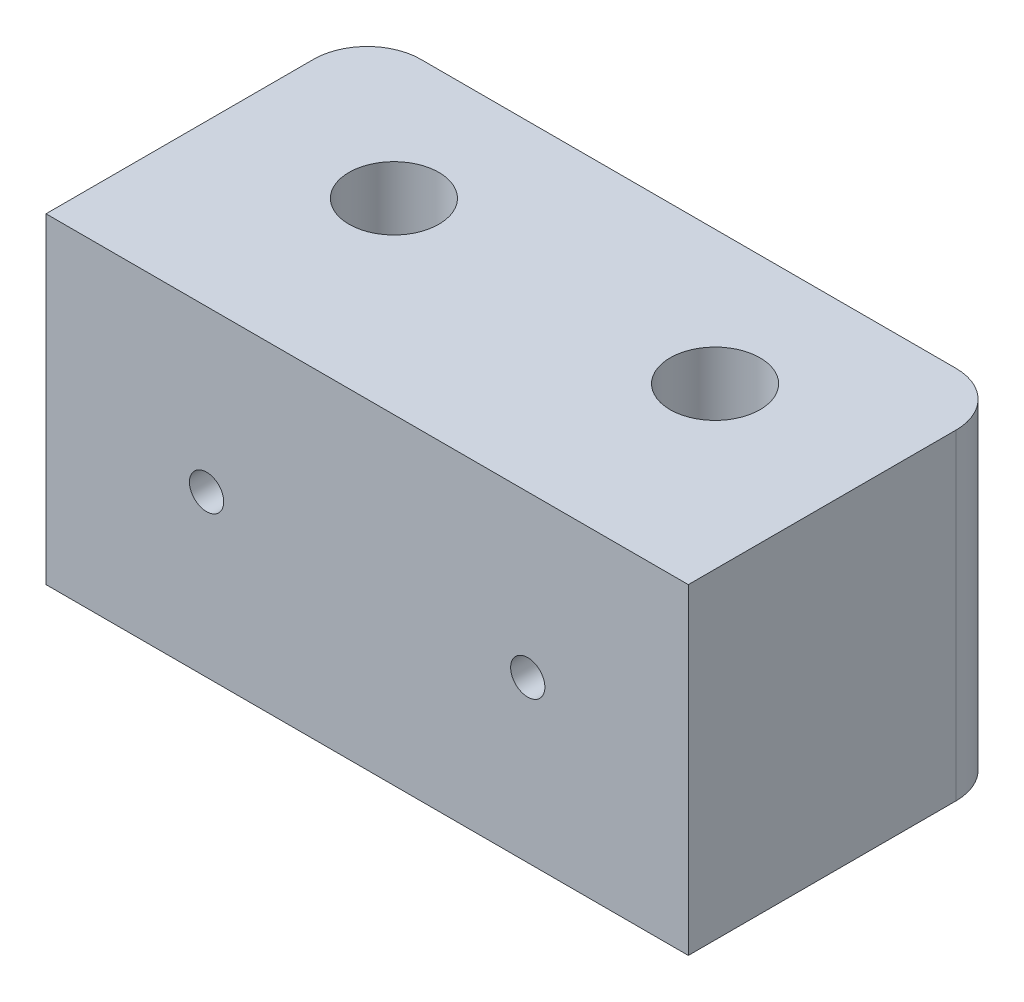
ISO-10303-21;
HEADER;
FILE_DESCRIPTION(('STEP AP214'),'2;1');
FILE_NAME('part.step','',(''),(''),'','','');
FILE_SCHEMA(('AUTOMOTIVE_DESIGN { 1 0 10303 214 1 1 1 1 }'));
ENDSEC;
DATA;
#1=APPLICATION_CONTEXT('core data for automotive mechanical design processes');
#2=APPLICATION_PROTOCOL_DEFINITION('international standard','automotive_design',2000,#1);
#3=PRODUCT_CONTEXT('',#1,'mechanical');
#4=PRODUCT('Part','Part','',(#3));
#5=PRODUCT_RELATED_PRODUCT_CATEGORY('part','',(#4));
#6=PRODUCT_DEFINITION_FORMATION('','',#4);
#7=PRODUCT_DEFINITION_CONTEXT('part definition',#1,'design');
#8=PRODUCT_DEFINITION('design','',#6,#7);
#9=PRODUCT_DEFINITION_SHAPE('','',#8);
#10=(LENGTH_UNIT() NAMED_UNIT(*) SI_UNIT(.MILLI.,.METRE.));
#11=(NAMED_UNIT(*) PLANE_ANGLE_UNIT() SI_UNIT($,.RADIAN.));
#12=(NAMED_UNIT(*) SI_UNIT($,.STERADIAN.) SOLID_ANGLE_UNIT());
#13=UNCERTAINTY_MEASURE_WITH_UNIT(LENGTH_MEASURE(1.E-05),#10,'distance_accuracy_value','');
#14=(GEOMETRIC_REPRESENTATION_CONTEXT(3) GLOBAL_UNCERTAINTY_ASSIGNED_CONTEXT((#13)) GLOBAL_UNIT_ASSIGNED_CONTEXT((#10,
#11,#12)) REPRESENTATION_CONTEXT('',''));
#15=CARTESIAN_POINT('',(0.,0.,0.));
#16=DIRECTION('',(0.,0.,1.));
#17=DIRECTION('',(1.,0.,0.));
#18=AXIS2_PLACEMENT_3D('',#15,#16,#17);
#19=CARTESIAN_POINT('',(-15.,15.,-7.5));
#20=DIRECTION('',(1.,0.,0.));
#21=DIRECTION('',(0.,0.,-1.));
#22=AXIS2_PLACEMENT_3D('',#19,#20,#21);
#23=PLANE('',#22);
#24=DIRECTION('',(0.,0.,1.));
#25=VECTOR('',#24,1.);
#26=CARTESIAN_POINT('',(-15.,15.,-7.5));
#27=LINE('',#26,#25);
#28=CARTESIAN_POINT('',(-15.,15.,-5.));
#29=VERTEX_POINT('',#28);
#30=CARTESIAN_POINT('',(-15.,15.,7.5));
#31=VERTEX_POINT('',#30);
#32=EDGE_CURVE('E140',#29,#31,#27,.T.);
#33=ORIENTED_EDGE('',*,*,#32,.F.);
#34=DIRECTION('',(0.,-1.,0.));
#35=VECTOR('',#34,1.);
#36=CARTESIAN_POINT('',(-15.,15.,-5.));
#37=LINE('',#36,#35);
#38=CARTESIAN_POINT('',(-15.,0.,-5.));
#39=VERTEX_POINT('',#38);
#40=EDGE_CURVE('E161',#29,#39,#37,.T.);
#41=ORIENTED_EDGE('',*,*,#40,.T.);
#42=DIRECTION('',(0.,0.,1.));
#43=VECTOR('',#42,1.);
#44=CARTESIAN_POINT('',(-15.,0.,-7.5));
#45=LINE('',#44,#43);
#46=CARTESIAN_POINT('',(-15.,0.,7.5));
#47=VERTEX_POINT('',#46);
#48=EDGE_CURVE('E139',#39,#47,#45,.T.);
#49=ORIENTED_EDGE('',*,*,#48,.T.);
#50=DIRECTION('',(0.,-1.,0.));
#51=VECTOR('',#50,1.);
#52=CARTESIAN_POINT('',(-15.,15.,7.5));
#53=LINE('',#52,#51);
#54=EDGE_CURVE('E158',#31,#47,#53,.T.);
#55=ORIENTED_EDGE('',*,*,#54,.F.);
#56=EDGE_LOOP('',(#33,#41,#49,#55));
#57=FACE_BOUND('',#56,.T.);
#58=ADVANCED_FACE('F41',(#57),#23,.F.);
#59=CARTESIAN_POINT('',(-15.,15.,7.5));
#60=DIRECTION('',(0.,0.,-1.));
#61=DIRECTION('',(-1.,0.,0.));
#62=AXIS2_PLACEMENT_3D('',#59,#60,#61);
#63=PLANE('',#62);
#64=CARTESIAN_POINT('',(7.5,7.5,7.5));
#65=DIRECTION('',(0.,0.,1.));
#66=DIRECTION('',(1.,0.,0.));
#67=AXIS2_PLACEMENT_3D('',#64,#65,#66);
#68=CIRCLE('',#67,0.799999999999999);
#69=CARTESIAN_POINT('',(8.3,7.5,7.5));
#70=VERTEX_POINT('',#69);
#71=EDGE_CURVE('E117',#70,#70,#68,.T.);
#72=ORIENTED_EDGE('',*,*,#71,.F.);
#73=EDGE_LOOP('',(#72));
#74=FACE_BOUND('',#73,.T.);
#75=CARTESIAN_POINT('',(-7.5,7.5,7.5));
#76=DIRECTION('',(0.,0.,1.));
#77=DIRECTION('',(1.,0.,0.));
#78=AXIS2_PLACEMENT_3D('',#75,#76,#77);
#79=CIRCLE('',#78,0.799999999999999);
#80=CARTESIAN_POINT('',(-6.7,7.5,7.5));
#81=VERTEX_POINT('',#80);
#82=EDGE_CURVE('E116',#81,#81,#79,.T.);
#83=ORIENTED_EDGE('',*,*,#82,.F.);
#84=EDGE_LOOP('',(#83));
#85=FACE_BOUND('',#84,.T.);
#86=DIRECTION('',(1.,0.,0.));
#87=VECTOR('',#86,1.);
#88=CARTESIAN_POINT('',(-15.,0.,7.5));
#89=LINE('',#88,#87);
#90=CARTESIAN_POINT('',(15.,0.,7.50000000000001));
#91=VERTEX_POINT('',#90);
#92=EDGE_CURVE('E151',#47,#91,#89,.T.);
#93=ORIENTED_EDGE('',*,*,#92,.T.);
#94=DIRECTION('',(0.,-1.,0.));
#95=VECTOR('',#94,1.);
#96=CARTESIAN_POINT('',(15.,15.,7.50000000000001));
#97=LINE('',#96,#95);
#98=CARTESIAN_POINT('',(15.,15.,7.50000000000001));
#99=VERTEX_POINT('',#98);
#100=EDGE_CURVE('E149',#99,#91,#97,.T.);
#101=ORIENTED_EDGE('',*,*,#100,.F.);
#102=DIRECTION('',(1.,0.,0.));
#103=VECTOR('',#102,1.);
#104=CARTESIAN_POINT('',(-15.,15.,7.5));
#105=LINE('',#104,#103);
#106=EDGE_CURVE('E142',#31,#99,#105,.T.);
#107=ORIENTED_EDGE('',*,*,#106,.F.);
#108=ORIENTED_EDGE('',*,*,#54,.T.);
#109=EDGE_LOOP('',(#93,#101,#107,#108));
#110=FACE_BOUND('',#109,.T.);
#111=ADVANCED_FACE('F196',(#74,#85,#110),#63,.F.);
#112=CARTESIAN_POINT('',(15.,15.,-7.50000000000001));
#113=DIRECTION('',(-1.,0.,0.));
#114=DIRECTION('',(0.,0.,1.));
#115=AXIS2_PLACEMENT_3D('',#112,#113,#114);
#116=PLANE('',#115);
#117=DIRECTION('',(0.,0.,-1.));
#118=VECTOR('',#117,1.);
#119=CARTESIAN_POINT('',(15.,0.,-7.50000000000001));
#120=LINE('',#119,#118);
#121=CARTESIAN_POINT('',(15.,0.,-5.));
#122=VERTEX_POINT('',#121);
#123=EDGE_CURVE('E153',#91,#122,#120,.T.);
#124=ORIENTED_EDGE('',*,*,#123,.T.);
#125=DIRECTION('',(0.,-1.,0.));
#126=VECTOR('',#125,1.);
#127=CARTESIAN_POINT('',(15.,15.,-5.));
#128=LINE('',#127,#126);
#129=CARTESIAN_POINT('',(15.,15.,-5.));
#130=VERTEX_POINT('',#129);
#131=EDGE_CURVE('E11',#122,#130,#128,.F.);
#132=ORIENTED_EDGE('',*,*,#131,.T.);
#133=DIRECTION('',(0.,0.,-1.));
#134=VECTOR('',#133,1.);
#135=CARTESIAN_POINT('',(15.,15.,-7.50000000000001));
#136=LINE('',#135,#134);
#137=EDGE_CURVE('E145',#99,#130,#136,.T.);
#138=ORIENTED_EDGE('',*,*,#137,.F.);
#139=ORIENTED_EDGE('',*,*,#100,.T.);
#140=EDGE_LOOP('',(#124,#132,#138,#139));
#141=FACE_BOUND('',#140,.T.);
#142=ADVANCED_FACE('F193',(#141),#116,.F.);
#143=CARTESIAN_POINT('',(-15.,15.,-7.5));
#144=DIRECTION('',(0.,0.,1.));
#145=DIRECTION('',(1.,0.,0.));
#146=AXIS2_PLACEMENT_3D('',#143,#144,#145);
#147=PLANE('',#146);
#148=DIRECTION('',(-1.,0.,0.));
#149=VECTOR('',#148,1.);
#150=CARTESIAN_POINT('',(-15.,0.,-7.5));
#151=LINE('',#150,#149);
#152=CARTESIAN_POINT('',(12.5,0.,-7.5));
#153=VERTEX_POINT('',#152);
#154=CARTESIAN_POINT('',(-12.5,0.,-7.5));
#155=VERTEX_POINT('',#154);
#156=EDGE_CURVE('E143',#153,#155,#151,.T.);
#157=ORIENTED_EDGE('',*,*,#156,.T.);
#158=DIRECTION('',(0.,-1.,0.));
#159=VECTOR('',#158,1.);
#160=CARTESIAN_POINT('',(-12.5,15.,-7.5));
#161=LINE('',#160,#159);
#162=CARTESIAN_POINT('',(-12.5,15.,-7.5));
#163=VERTEX_POINT('',#162);
#164=EDGE_CURVE('E62',#155,#163,#161,.F.);
#165=ORIENTED_EDGE('',*,*,#164,.T.);
#166=DIRECTION('',(-1.,0.,0.));
#167=VECTOR('',#166,1.);
#168=CARTESIAN_POINT('',(-15.,15.,-7.5));
#169=LINE('',#168,#167);
#170=CARTESIAN_POINT('',(12.5,15.,-7.5));
#171=VERTEX_POINT('',#170);
#172=EDGE_CURVE('E147',#171,#163,#169,.T.);
#173=ORIENTED_EDGE('',*,*,#172,.F.);
#174=DIRECTION('',(0.,-1.,0.));
#175=VECTOR('',#174,1.);
#176=CARTESIAN_POINT('',(12.5,15.,-7.5));
#177=LINE('',#176,#175);
#178=EDGE_CURVE('E168',#171,#153,#177,.T.);
#179=ORIENTED_EDGE('',*,*,#178,.T.);
#180=EDGE_LOOP('',(#157,#165,#173,#179));
#181=FACE_BOUND('',#180,.T.);
#182=ADVANCED_FACE('F188',(#181),#147,.F.);
#183=CARTESIAN_POINT('',(0.,15.,0.));
#184=DIRECTION('',(0.,1.,0.));
#185=DIRECTION('',(0.,0.,1.));
#186=AXIS2_PLACEMENT_3D('',#183,#184,#185);
#187=PLANE('',#186);
#188=CARTESIAN_POINT('',(-7.5,15.,-1.25));
#189=DIRECTION('',(0.,1.,0.));
#190=DIRECTION('',(0.,0.,1.));
#191=AXIS2_PLACEMENT_3D('',#188,#189,#190);
#192=CIRCLE('',#191,2.09999999999999);
#193=CARTESIAN_POINT('',(-7.5,15.,0.849999999999985));
#194=VERTEX_POINT('',#193);
#195=EDGE_CURVE('E127',#194,#194,#192,.T.);
#196=ORIENTED_EDGE('',*,*,#195,.F.);
#197=EDGE_LOOP('',(#196));
#198=FACE_BOUND('',#197,.T.);
#199=CARTESIAN_POINT('',(7.5,15.,-1.25000000000001));
#200=DIRECTION('',(0.,1.,0.));
#201=DIRECTION('',(0.,0.,1.));
#202=AXIS2_PLACEMENT_3D('',#199,#200,#201);
#203=CIRCLE('',#202,2.09999999999999);
#204=CARTESIAN_POINT('',(7.5,15.,0.849999999999984));
#205=VERTEX_POINT('',#204);
#206=EDGE_CURVE('E133',#205,#205,#203,.T.);
#207=ORIENTED_EDGE('',*,*,#206,.F.);
#208=EDGE_LOOP('',(#207));
#209=FACE_BOUND('',#208,.T.);
#210=ORIENTED_EDGE('',*,*,#172,.T.);
#211=CARTESIAN_POINT('',(-12.5,15.,-5.));
#212=DIRECTION('',(0.,1.,0.));
#213=DIRECTION('',(0.,0.,1.));
#214=AXIS2_PLACEMENT_3D('',#211,#212,#213);
#215=CIRCLE('',#214,2.5);
#216=EDGE_CURVE('E49',#163,#29,#215,.T.);
#217=ORIENTED_EDGE('',*,*,#216,.T.);
#218=ORIENTED_EDGE('',*,*,#32,.T.);
#219=ORIENTED_EDGE('',*,*,#106,.T.);
#220=ORIENTED_EDGE('',*,*,#137,.T.);
#221=CARTESIAN_POINT('',(12.5,15.,-5.));
#222=DIRECTION('',(0.,1.,0.));
#223=DIRECTION('',(0.,0.,1.));
#224=AXIS2_PLACEMENT_3D('',#221,#222,#223);
#225=CIRCLE('',#224,2.5);
#226=EDGE_CURVE('E172',#130,#171,#225,.T.);
#227=ORIENTED_EDGE('',*,*,#226,.T.);
#228=EDGE_LOOP('',(#210,#217,#218,#219,#220,#227));
#229=FACE_BOUND('',#228,.T.);
#230=ADVANCED_FACE('F176',(#198,#209,#229),#187,.T.);
#231=CARTESIAN_POINT('',(0.,0.,0.));
#232=DIRECTION('',(0.,1.,0.));
#233=DIRECTION('',(0.,0.,1.));
#234=AXIS2_PLACEMENT_3D('',#231,#232,#233);
#235=PLANE('',#234);
#236=ORIENTED_EDGE('',*,*,#48,.F.);
#237=CARTESIAN_POINT('',(-12.5,0.,-5.));
#238=DIRECTION('',(0.,1.,0.));
#239=DIRECTION('',(0.,0.,1.));
#240=AXIS2_PLACEMENT_3D('',#237,#238,#239);
#241=CIRCLE('',#240,2.5);
#242=EDGE_CURVE('E166',#39,#155,#241,.F.);
#243=ORIENTED_EDGE('',*,*,#242,.T.);
#244=ORIENTED_EDGE('',*,*,#156,.F.);
#245=CARTESIAN_POINT('',(12.5,0.,-5.));
#246=DIRECTION('',(0.,1.,0.));
#247=DIRECTION('',(0.,0.,1.));
#248=AXIS2_PLACEMENT_3D('',#245,#246,#247);
#249=CIRCLE('',#248,2.5);
#250=EDGE_CURVE('E164',#153,#122,#249,.F.);
#251=ORIENTED_EDGE('',*,*,#250,.T.);
#252=ORIENTED_EDGE('',*,*,#123,.F.);
#253=ORIENTED_EDGE('',*,*,#92,.F.);
#254=EDGE_LOOP('',(#236,#243,#244,#251,#252,#253));
#255=FACE_BOUND('',#254,.T.);
#256=ADVANCED_FACE('F186',(#255),#235,.F.);
#257=CARTESIAN_POINT('',(-12.5,15.,-5.));
#258=DIRECTION('',(0.,-1.,0.));
#259=DIRECTION('',(0.,0.,-1.));
#260=AXIS2_PLACEMENT_3D('',#257,#258,#259);
#261=CYLINDRICAL_SURFACE('',#260,2.5);
#262=ORIENTED_EDGE('',*,*,#216,.F.);
#263=ORIENTED_EDGE('',*,*,#164,.F.);
#264=ORIENTED_EDGE('',*,*,#242,.F.);
#265=ORIENTED_EDGE('',*,*,#40,.F.);
#266=EDGE_LOOP('',(#262,#263,#264,#265));
#267=FACE_BOUND('',#266,.T.);
#268=ADVANCED_FACE('F183',(#267),#261,.T.);
#269=CARTESIAN_POINT('',(12.5,15.,-5.));
#270=DIRECTION('',(0.,-1.,0.));
#271=DIRECTION('',(0.,0.,-1.));
#272=AXIS2_PLACEMENT_3D('',#269,#270,#271);
#273=CYLINDRICAL_SURFACE('',#272,2.5);
#274=ORIENTED_EDGE('',*,*,#226,.F.);
#275=ORIENTED_EDGE('',*,*,#131,.F.);
#276=ORIENTED_EDGE('',*,*,#250,.F.);
#277=ORIENTED_EDGE('',*,*,#178,.F.);
#278=EDGE_LOOP('',(#274,#275,#276,#277));
#279=FACE_BOUND('',#278,.T.);
#280=ADVANCED_FACE('F43',(#279),#273,.T.);
#281=CARTESIAN_POINT('',(7.5,2.6,-1.25000000000001));
#282=DIRECTION('',(0.,1.,0.));
#283=DIRECTION('',(0.,0.,1.));
#284=AXIS2_PLACEMENT_3D('',#281,#282,#283);
#285=CONICAL_SURFACE('',#284,2.09999999999999,1.02974425867665);
#286=CARTESIAN_POINT('',(7.5,1.33819270004214,-1.25000000000001));
#287=VERTEX_POINT('',#286);
#288=VERTEX_LOOP('',#287);
#289=FACE_BOUND('',#288,.T.);
#290=CARTESIAN_POINT('',(7.5,2.6,-1.25000000000001));
#291=DIRECTION('',(0.,1.,0.));
#292=DIRECTION('',(0.,0.,1.));
#293=AXIS2_PLACEMENT_3D('',#290,#291,#292);
#294=CIRCLE('',#293,2.09999999999999);
#295=CARTESIAN_POINT('',(7.5,2.6,0.849999999999982));
#296=VERTEX_POINT('',#295);
#297=EDGE_CURVE('E136',#296,#296,#294,.T.);
#298=ORIENTED_EDGE('',*,*,#297,.T.);
#299=EDGE_LOOP('',(#298));
#300=FACE_BOUND('',#299,.T.);
#301=ADVANCED_FACE('F214',(#289,#300),#285,.F.);
#302=CARTESIAN_POINT('',(7.5,15.,-1.25000000000001));
#303=DIRECTION('',(0.,1.,0.));
#304=DIRECTION('',(0.,0.,1.));
#305=AXIS2_PLACEMENT_3D('',#302,#303,#304);
#306=CYLINDRICAL_SURFACE('',#305,2.09999999999999);
#307=ORIENTED_EDGE('',*,*,#297,.F.);
#308=EDGE_LOOP('',(#307));
#309=FACE_BOUND('',#308,.T.);
#310=ORIENTED_EDGE('',*,*,#206,.T.);
#311=EDGE_LOOP('',(#310));
#312=FACE_BOUND('',#311,.T.);
#313=ADVANCED_FACE('F244',(#309,#312),#306,.F.);
#314=CARTESIAN_POINT('',(-7.5,2.6,-1.25));
#315=DIRECTION('',(0.,1.,0.));
#316=DIRECTION('',(0.,0.,1.));
#317=AXIS2_PLACEMENT_3D('',#314,#315,#316);
#318=CONICAL_SURFACE('',#317,2.09999999999999,1.02974425867665);
#319=CARTESIAN_POINT('',(-7.5,1.33819270004214,-1.25));
#320=VERTEX_POINT('',#319);
#321=VERTEX_LOOP('',#320);
#322=FACE_BOUND('',#321,.T.);
#323=CARTESIAN_POINT('',(-7.5,2.6,-1.25));
#324=DIRECTION('',(0.,1.,0.));
#325=DIRECTION('',(0.,0.,1.));
#326=AXIS2_PLACEMENT_3D('',#323,#324,#325);
#327=CIRCLE('',#326,2.09999999999999);
#328=CARTESIAN_POINT('',(-7.5,2.6,0.849999999999984));
#329=VERTEX_POINT('',#328);
#330=EDGE_CURVE('E130',#329,#329,#327,.T.);
#331=ORIENTED_EDGE('',*,*,#330,.T.);
#332=EDGE_LOOP('',(#331));
#333=FACE_BOUND('',#332,.T.);
#334=ADVANCED_FACE('F253',(#322,#333),#318,.F.);
#335=CARTESIAN_POINT('',(-7.5,15.,-1.25));
#336=DIRECTION('',(0.,1.,0.));
#337=DIRECTION('',(0.,0.,1.));
#338=AXIS2_PLACEMENT_3D('',#335,#336,#337);
#339=CYLINDRICAL_SURFACE('',#338,2.09999999999999);
#340=ORIENTED_EDGE('',*,*,#330,.F.);
#341=EDGE_LOOP('',(#340));
#342=FACE_BOUND('',#341,.T.);
#343=ORIENTED_EDGE('',*,*,#195,.T.);
#344=EDGE_LOOP('',(#343));
#345=FACE_BOUND('',#344,.T.);
#346=ADVANCED_FACE('F263',(#342,#345),#339,.F.);
#347=CARTESIAN_POINT('',(-7.5,7.5,2.5));
#348=DIRECTION('',(0.,0.,1.));
#349=DIRECTION('',(1.,0.,0.));
#350=AXIS2_PLACEMENT_3D('',#347,#348,#349);
#351=CONICAL_SURFACE('',#350,0.799999999999999,1.02974425867665);
#352=CARTESIAN_POINT('',(-7.5,7.5,2.01931150477795));
#353=VERTEX_POINT('',#352);
#354=VERTEX_LOOP('',#353);
#355=FACE_BOUND('',#354,.T.);
#356=CARTESIAN_POINT('',(-7.5,7.5,2.5));
#357=DIRECTION('',(0.,0.,1.));
#358=DIRECTION('',(1.,0.,0.));
#359=AXIS2_PLACEMENT_3D('',#356,#357,#358);
#360=CIRCLE('',#359,0.799999999999999);
#361=CARTESIAN_POINT('',(-6.7,7.5,2.5));
#362=VERTEX_POINT('',#361);
#363=EDGE_CURVE('E120',#362,#362,#360,.T.);
#364=ORIENTED_EDGE('',*,*,#363,.T.);
#365=EDGE_LOOP('',(#364));
#366=FACE_BOUND('',#365,.T.);
#367=ADVANCED_FACE('F272',(#355,#366),#351,.F.);
#368=CARTESIAN_POINT('',(-7.5,7.5,7.5));
#369=DIRECTION('',(0.,0.,1.));
#370=DIRECTION('',(1.,0.,0.));
#371=AXIS2_PLACEMENT_3D('',#368,#369,#370);
#372=CYLINDRICAL_SURFACE('',#371,0.799999999999999);
#373=ORIENTED_EDGE('',*,*,#363,.F.);
#374=EDGE_LOOP('',(#373));
#375=FACE_BOUND('',#374,.T.);
#376=ORIENTED_EDGE('',*,*,#82,.T.);
#377=EDGE_LOOP('',(#376));
#378=FACE_BOUND('',#377,.T.);
#379=ADVANCED_FACE('F110',(#375,#378),#372,.F.);
#380=CARTESIAN_POINT('',(7.5,7.5,2.5));
#381=DIRECTION('',(0.,0.,1.));
#382=DIRECTION('',(1.,0.,0.));
#383=AXIS2_PLACEMENT_3D('',#380,#381,#382);
#384=CONICAL_SURFACE('',#383,0.799999999999999,1.02974425867665);
#385=CARTESIAN_POINT('',(7.5,7.5,2.01931150477795));
#386=VERTEX_POINT('',#385);
#387=VERTEX_LOOP('',#386);
#388=FACE_BOUND('',#387,.T.);
#389=CARTESIAN_POINT('',(7.5,7.5,2.5));
#390=DIRECTION('',(0.,0.,1.));
#391=DIRECTION('',(1.,0.,0.));
#392=AXIS2_PLACEMENT_3D('',#389,#390,#391);
#393=CIRCLE('',#392,0.799999999999999);
#394=CARTESIAN_POINT('',(8.3,7.5,2.5));
#395=VERTEX_POINT('',#394);
#396=EDGE_CURVE('E114',#395,#395,#393,.T.);
#397=ORIENTED_EDGE('',*,*,#396,.T.);
#398=EDGE_LOOP('',(#397));
#399=FACE_BOUND('',#398,.T.);
#400=ADVANCED_FACE('F106',(#388,#399),#384,.F.);
#401=CARTESIAN_POINT('',(7.5,7.5,7.5));
#402=DIRECTION('',(0.,0.,1.));
#403=DIRECTION('',(1.,0.,0.));
#404=AXIS2_PLACEMENT_3D('',#401,#402,#403);
#405=CYLINDRICAL_SURFACE('',#404,0.799999999999999);
#406=ORIENTED_EDGE('',*,*,#396,.F.);
#407=EDGE_LOOP('',(#406));
#408=FACE_BOUND('',#407,.T.);
#409=ORIENTED_EDGE('',*,*,#71,.T.);
#410=EDGE_LOOP('',(#409));
#411=FACE_BOUND('',#410,.T.);
#412=ADVANCED_FACE('F109',(#408,#411),#405,.F.);
#413=CLOSED_SHELL('',(#58,#111,#142,#182,#230,#256,#268,#280,#301,#313,#334,#346,#367,#379,#400,#412));
#414=MANIFOLD_SOLID_BREP('B2',#413);
#415=ADVANCED_BREP_SHAPE_REPRESENTATION('',(#18,#414),#14);
#416=SHAPE_DEFINITION_REPRESENTATION(#9,#415);
ENDSEC;
END-ISO-10303-21;
